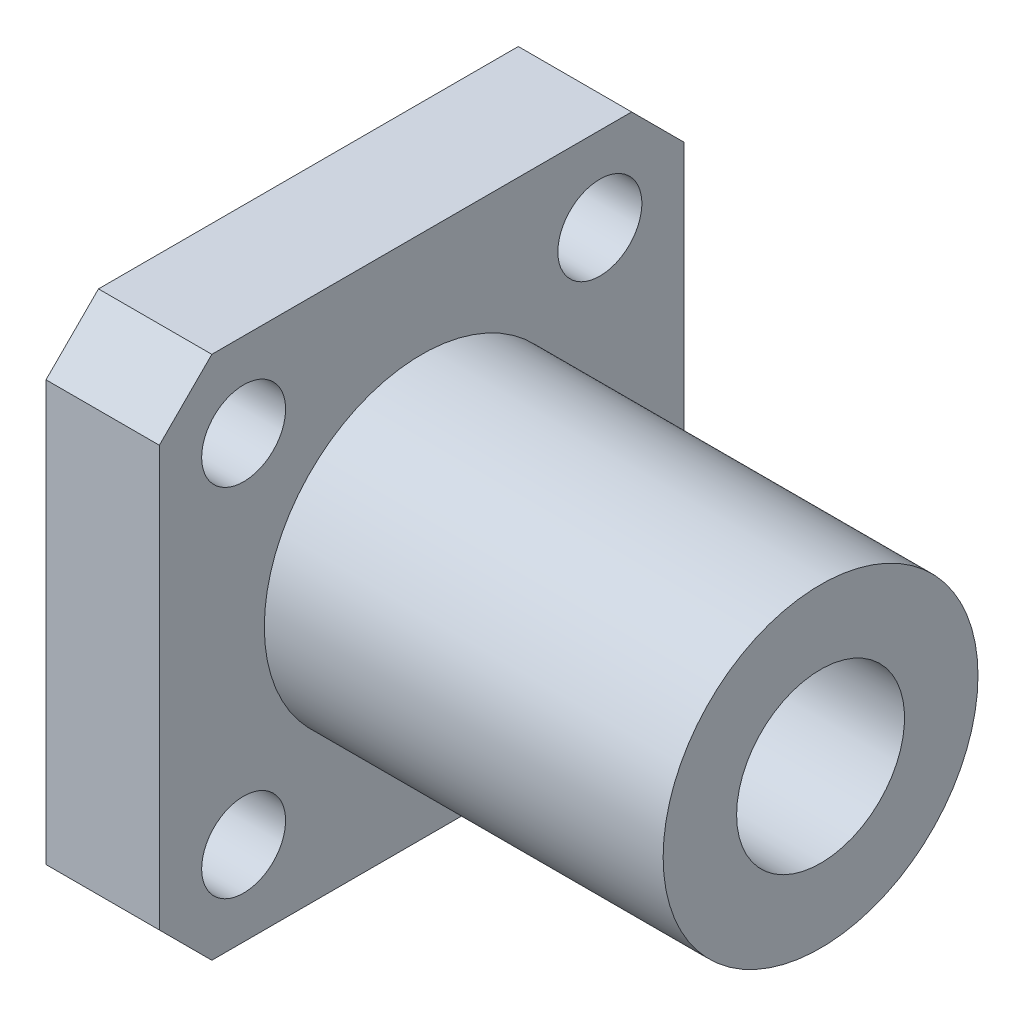
ISO-10303-21;
HEADER;
FILE_DESCRIPTION(('STEP AP214'),'2;1');
FILE_NAME('part.step','',(''),(''),'','','');
FILE_SCHEMA(('AUTOMOTIVE_DESIGN { 1 0 10303 214 1 1 1 1 }'));
ENDSEC;
DATA;
#1=APPLICATION_CONTEXT('core data for automotive mechanical design processes');
#2=APPLICATION_PROTOCOL_DEFINITION('international standard','automotive_design',2000,#1);
#3=PRODUCT_CONTEXT('',#1,'mechanical');
#4=PRODUCT('Part','Part','',(#3));
#5=PRODUCT_RELATED_PRODUCT_CATEGORY('part','',(#4));
#6=PRODUCT_DEFINITION_FORMATION('','',#4);
#7=PRODUCT_DEFINITION_CONTEXT('part definition',#1,'design');
#8=PRODUCT_DEFINITION('design','',#6,#7);
#9=PRODUCT_DEFINITION_SHAPE('','',#8);
#10=(LENGTH_UNIT() NAMED_UNIT(*) SI_UNIT(.MILLI.,.METRE.));
#11=(NAMED_UNIT(*) PLANE_ANGLE_UNIT() SI_UNIT($,.RADIAN.));
#12=(NAMED_UNIT(*) SI_UNIT($,.STERADIAN.) SOLID_ANGLE_UNIT());
#13=UNCERTAINTY_MEASURE_WITH_UNIT(LENGTH_MEASURE(1.E-05),#10,'distance_accuracy_value','');
#14=(GEOMETRIC_REPRESENTATION_CONTEXT(3) GLOBAL_UNCERTAINTY_ASSIGNED_CONTEXT((#13)) GLOBAL_UNIT_ASSIGNED_CONTEXT((#10,
#11,#12)) REPRESENTATION_CONTEXT('',''));
#15=CARTESIAN_POINT('',(0.,0.,0.));
#16=DIRECTION('',(0.,0.,1.));
#17=DIRECTION('',(1.,0.,0.));
#18=AXIS2_PLACEMENT_3D('',#15,#16,#17);
#19=CARTESIAN_POINT('',(5.4,0.,0.));
#20=DIRECTION('',(-1.,0.,0.));
#21=DIRECTION('',(0.,0.,1.));
#22=AXIS2_PLACEMENT_3D('',#19,#20,#21);
#23=PLANE('',#22);
#24=CARTESIAN_POINT('',(5.4,8.4852813742381,8.48528137423857));
#25=DIRECTION('',(1.,0.,0.));
#26=DIRECTION('',(0.,0.,-1.));
#27=AXIS2_PLACEMENT_3D('',#24,#25,#26);
#28=CIRCLE('',#27,2.00000000000051);
#29=CARTESIAN_POINT('',(5.4,8.4852813742381,10.4852813742391));
#30=VERTEX_POINT('',#29);
#31=EDGE_CURVE('E201',#30,#30,#28,.T.);
#32=ORIENTED_EDGE('',*,*,#31,.F.);
#33=EDGE_LOOP('',(#32));
#34=FACE_BOUND('',#33,.T.);
#35=CARTESIAN_POINT('',(5.4,-8.48528137423904,8.4852813742381));
#36=DIRECTION('',(1.,0.,0.));
#37=DIRECTION('',(0.,0.,-1.));
#38=AXIS2_PLACEMENT_3D('',#35,#36,#37);
#39=CIRCLE('',#38,2.00000000000035);
#40=CARTESIAN_POINT('',(5.4,-8.48528137423904,10.4852813742385));
#41=VERTEX_POINT('',#40);
#42=EDGE_CURVE('E195',#41,#41,#39,.T.);
#43=ORIENTED_EDGE('',*,*,#42,.F.);
#44=EDGE_LOOP('',(#43));
#45=FACE_BOUND('',#44,.T.);
#46=CARTESIAN_POINT('',(5.4,-8.48528137423857,-8.48528137423904));
#47=DIRECTION('',(1.,0.,0.));
#48=DIRECTION('',(0.,0.,-1.));
#49=AXIS2_PLACEMENT_3D('',#46,#47,#48);
#50=CIRCLE('',#49,1.99999999999988);
#51=CARTESIAN_POINT('',(5.4,-8.48528137423857,-6.48528137423916));
#52=VERTEX_POINT('',#51);
#53=EDGE_CURVE('E189',#52,#52,#50,.T.);
#54=ORIENTED_EDGE('',*,*,#53,.F.);
#55=EDGE_LOOP('',(#54));
#56=FACE_BOUND('',#55,.T.);
#57=CARTESIAN_POINT('',(5.4,8.48528137423857,-8.48528137423857));
#58=DIRECTION('',(1.,0.,0.));
#59=DIRECTION('',(0.,0.,-1.));
#60=AXIS2_PLACEMENT_3D('',#57,#58,#59);
#61=CIRCLE('',#60,2.);
#62=CARTESIAN_POINT('',(5.4,8.48528137423857,-6.48528137423857));
#63=VERTEX_POINT('',#62);
#64=EDGE_CURVE('E185',#63,#63,#61,.T.);
#65=ORIENTED_EDGE('',*,*,#64,.F.);
#66=EDGE_LOOP('',(#65));
#67=FACE_BOUND('',#66,.T.);
#68=DIRECTION('',(0.,0.,1.));
#69=VECTOR('',#68,1.);
#70=CARTESIAN_POINT('',(5.4,12.5,10.));
#71=LINE('',#70,#69);
#72=CARTESIAN_POINT('',(5.4,12.5,-9.99999999999999));
#73=VERTEX_POINT('',#72);
#74=CARTESIAN_POINT('',(5.4,12.5,10.));
#75=VERTEX_POINT('',#74);
#76=EDGE_CURVE('E145',#73,#75,#71,.T.);
#77=ORIENTED_EDGE('',*,*,#76,.T.);
#78=DIRECTION('',(0.,-0.707106781186548,0.707106781186548));
#79=VECTOR('',#78,1.);
#80=CARTESIAN_POINT('',(5.4,10.,12.5));
#81=LINE('',#80,#79);
#82=CARTESIAN_POINT('',(5.4,10.,12.5));
#83=VERTEX_POINT('',#82);
#84=EDGE_CURVE('E93',#75,#83,#81,.T.);
#85=ORIENTED_EDGE('',*,*,#84,.T.);
#86=DIRECTION('',(0.,-1.,0.));
#87=VECTOR('',#86,1.);
#88=CARTESIAN_POINT('',(5.4,10.,12.5));
#89=LINE('',#88,#87);
#90=CARTESIAN_POINT('',(5.4,-9.99999999999999,12.5));
#91=VERTEX_POINT('',#90);
#92=EDGE_CURVE('E177',#83,#91,#89,.T.);
#93=ORIENTED_EDGE('',*,*,#92,.T.);
#94=DIRECTION('',(0.,-0.707106781186548,-0.707106781186547));
#95=VECTOR('',#94,1.);
#96=CARTESIAN_POINT('',(5.4,-9.99999999999999,12.5));
#97=LINE('',#96,#95);
#98=CARTESIAN_POINT('',(5.4,-12.5,9.99999999999999));
#99=VERTEX_POINT('',#98);
#100=EDGE_CURVE('E176',#91,#99,#97,.T.);
#101=ORIENTED_EDGE('',*,*,#100,.T.);
#102=DIRECTION('',(0.,0.,-1.));
#103=VECTOR('',#102,1.);
#104=CARTESIAN_POINT('',(5.4,-12.5,9.99999999999999));
#105=LINE('',#104,#103);
#106=CARTESIAN_POINT('',(5.4,-12.5,-10.));
#107=VERTEX_POINT('',#106);
#108=EDGE_CURVE('E112',#99,#107,#105,.T.);
#109=ORIENTED_EDGE('',*,*,#108,.T.);
#110=DIRECTION('',(0.,0.707106781186548,-0.707106781186547));
#111=VECTOR('',#110,1.);
#112=CARTESIAN_POINT('',(5.4,-12.5,-10.));
#113=LINE('',#112,#111);
#114=CARTESIAN_POINT('',(5.4,-10.,-12.5));
#115=VERTEX_POINT('',#114);
#116=EDGE_CURVE('E106',#107,#115,#113,.T.);
#117=ORIENTED_EDGE('',*,*,#116,.T.);
#118=DIRECTION('',(0.,1.,0.));
#119=VECTOR('',#118,1.);
#120=CARTESIAN_POINT('',(5.4,10.,-12.5));
#121=LINE('',#120,#119);
#122=CARTESIAN_POINT('',(5.4,10.,-12.5));
#123=VERTEX_POINT('',#122);
#124=EDGE_CURVE('E110',#115,#123,#121,.T.);
#125=ORIENTED_EDGE('',*,*,#124,.T.);
#126=DIRECTION('',(0.,0.707106781186547,0.707106781186547));
#127=VECTOR('',#126,1.);
#128=CARTESIAN_POINT('',(5.4,12.5,-9.99999999999999));
#129=LINE('',#128,#127);
#130=EDGE_CURVE('E49',#123,#73,#129,.T.);
#131=ORIENTED_EDGE('',*,*,#130,.T.);
#132=EDGE_LOOP('',(#77,#85,#93,#101,#109,#117,#125,#131));
#133=FACE_BOUND('',#132,.T.);
#134=CARTESIAN_POINT('',(5.4,0.,0.));
#135=DIRECTION('',(-1.,0.,0.));
#136=DIRECTION('',(0.,0.,1.));
#137=AXIS2_PLACEMENT_3D('',#134,#135,#136);
#138=CIRCLE('',#137,7.5);
#139=CARTESIAN_POINT('',(5.4,0.,7.5));
#140=VERTEX_POINT('',#139);
#141=EDGE_CURVE('E11',#140,#140,#138,.F.);
#142=ORIENTED_EDGE('',*,*,#141,.F.);
#143=EDGE_LOOP('',(#142));
#144=FACE_BOUND('',#143,.T.);
#145=ADVANCED_FACE('F32',(#34,#45,#56,#67,#133,#144),#23,.F.);
#146=CARTESIAN_POINT('',(0.,0.,0.));
#147=DIRECTION('',(-1.,0.,0.));
#148=DIRECTION('',(0.,0.,1.));
#149=AXIS2_PLACEMENT_3D('',#146,#147,#148);
#150=PLANE('',#149);
#151=CARTESIAN_POINT('',(0.,-8.48528137423904,8.4852813742381));
#152=DIRECTION('',(1.,0.,0.));
#153=DIRECTION('',(0.,0.,-1.));
#154=AXIS2_PLACEMENT_3D('',#151,#152,#153);
#155=CIRCLE('',#154,2.00000000000035);
#156=CARTESIAN_POINT('',(0.,-8.48528137423904,10.4852813742385));
#157=VERTEX_POINT('',#156);
#158=EDGE_CURVE('E198',#157,#157,#155,.T.);
#159=ORIENTED_EDGE('',*,*,#158,.T.);
#160=EDGE_LOOP('',(#159));
#161=FACE_BOUND('',#160,.T.);
#162=CARTESIAN_POINT('',(0.,8.48528137423857,-8.48528137423857));
#163=DIRECTION('',(1.,0.,0.));
#164=DIRECTION('',(0.,0.,-1.));
#165=AXIS2_PLACEMENT_3D('',#162,#163,#164);
#166=CIRCLE('',#165,2.);
#167=CARTESIAN_POINT('',(0.,8.48528137423857,-6.48528137423857));
#168=VERTEX_POINT('',#167);
#169=EDGE_CURVE('E186',#168,#168,#166,.T.);
#170=ORIENTED_EDGE('',*,*,#169,.T.);
#171=EDGE_LOOP('',(#170));
#172=FACE_BOUND('',#171,.T.);
#173=DIRECTION('',(0.,0.,1.));
#174=VECTOR('',#173,1.);
#175=CARTESIAN_POINT('',(0.,12.5,10.));
#176=LINE('',#175,#174);
#177=CARTESIAN_POINT('',(0.,12.5,-9.99999999999999));
#178=VERTEX_POINT('',#177);
#179=CARTESIAN_POINT('',(0.,12.5,10.));
#180=VERTEX_POINT('',#179);
#181=EDGE_CURVE('E130',#178,#180,#176,.T.);
#182=ORIENTED_EDGE('',*,*,#181,.F.);
#183=DIRECTION('',(0.,0.707106781186547,0.707106781186547));
#184=VECTOR('',#183,1.);
#185=CARTESIAN_POINT('',(0.,12.5,-9.99999999999999));
#186=LINE('',#185,#184);
#187=CARTESIAN_POINT('',(0.,10.,-12.5));
#188=VERTEX_POINT('',#187);
#189=EDGE_CURVE('E84',#188,#178,#186,.T.);
#190=ORIENTED_EDGE('',*,*,#189,.F.);
#191=DIRECTION('',(0.,1.,0.));
#192=VECTOR('',#191,1.);
#193=CARTESIAN_POINT('',(0.,10.,-12.5));
#194=LINE('',#193,#192);
#195=CARTESIAN_POINT('',(0.,-10.,-12.5));
#196=VERTEX_POINT('',#195);
#197=EDGE_CURVE('E78',#196,#188,#194,.T.);
#198=ORIENTED_EDGE('',*,*,#197,.F.);
#199=DIRECTION('',(0.,0.707106781186548,-0.707106781186547));
#200=VECTOR('',#199,1.);
#201=CARTESIAN_POINT('',(0.,-12.5,-10.));
#202=LINE('',#201,#200);
#203=CARTESIAN_POINT('',(0.,-12.5,-10.));
#204=VERTEX_POINT('',#203);
#205=EDGE_CURVE('E120',#204,#196,#202,.T.);
#206=ORIENTED_EDGE('',*,*,#205,.F.);
#207=DIRECTION('',(0.,0.,-1.));
#208=VECTOR('',#207,1.);
#209=CARTESIAN_POINT('',(0.,-12.5,9.99999999999999));
#210=LINE('',#209,#208);
#211=CARTESIAN_POINT('',(0.,-12.5,9.99999999999999));
#212=VERTEX_POINT('',#211);
#213=EDGE_CURVE('E140',#212,#204,#210,.T.);
#214=ORIENTED_EDGE('',*,*,#213,.F.);
#215=DIRECTION('',(0.,-0.707106781186548,-0.707106781186547));
#216=VECTOR('',#215,1.);
#217=CARTESIAN_POINT('',(0.,-9.99999999999999,12.5));
#218=LINE('',#217,#216);
#219=CARTESIAN_POINT('',(0.,-9.99999999999999,12.5));
#220=VERTEX_POINT('',#219);
#221=EDGE_CURVE('E138',#220,#212,#218,.T.);
#222=ORIENTED_EDGE('',*,*,#221,.F.);
#223=DIRECTION('',(0.,-1.,0.));
#224=VECTOR('',#223,1.);
#225=CARTESIAN_POINT('',(0.,10.,12.5));
#226=LINE('',#225,#224);
#227=CARTESIAN_POINT('',(0.,10.,12.5));
#228=VERTEX_POINT('',#227);
#229=EDGE_CURVE('E136',#228,#220,#226,.T.);
#230=ORIENTED_EDGE('',*,*,#229,.F.);
#231=DIRECTION('',(0.,-0.707106781186548,0.707106781186548));
#232=VECTOR('',#231,1.);
#233=CARTESIAN_POINT('',(0.,10.,12.5));
#234=LINE('',#233,#232);
#235=EDGE_CURVE('E133',#180,#228,#234,.T.);
#236=ORIENTED_EDGE('',*,*,#235,.F.);
#237=EDGE_LOOP('',(#182,#190,#198,#206,#214,#222,#230,#236));
#238=FACE_BOUND('',#237,.T.);
#239=CARTESIAN_POINT('',(0.,0.,0.));
#240=DIRECTION('',(1.,0.,0.));
#241=DIRECTION('',(0.,0.,-1.));
#242=AXIS2_PLACEMENT_3D('',#239,#240,#241);
#243=CIRCLE('',#242,4.);
#244=CARTESIAN_POINT('',(0.,0.,4.));
#245=VERTEX_POINT('',#244);
#246=EDGE_CURVE('E134',#245,#245,#243,.T.);
#247=ORIENTED_EDGE('',*,*,#246,.T.);
#248=EDGE_LOOP('',(#247));
#249=FACE_BOUND('',#248,.T.);
#250=CARTESIAN_POINT('',(0.,-8.48528137423857,-8.48528137423904));
#251=DIRECTION('',(1.,0.,0.));
#252=DIRECTION('',(0.,0.,-1.));
#253=AXIS2_PLACEMENT_3D('',#250,#251,#252);
#254=CIRCLE('',#253,1.99999999999988);
#255=CARTESIAN_POINT('',(0.,-8.48528137423857,-6.48528137423916));
#256=VERTEX_POINT('',#255);
#257=EDGE_CURVE('E192',#256,#256,#254,.T.);
#258=ORIENTED_EDGE('',*,*,#257,.T.);
#259=EDGE_LOOP('',(#258));
#260=FACE_BOUND('',#259,.T.);
#261=CARTESIAN_POINT('',(0.,8.4852813742381,8.48528137423857));
#262=DIRECTION('',(1.,0.,0.));
#263=DIRECTION('',(0.,0.,-1.));
#264=AXIS2_PLACEMENT_3D('',#261,#262,#263);
#265=CIRCLE('',#264,2.00000000000051);
#266=CARTESIAN_POINT('',(0.,8.4852813742381,10.4852813742391));
#267=VERTEX_POINT('',#266);
#268=EDGE_CURVE('E204',#267,#267,#265,.T.);
#269=ORIENTED_EDGE('',*,*,#268,.T.);
#270=EDGE_LOOP('',(#269));
#271=FACE_BOUND('',#270,.T.);
#272=ADVANCED_FACE('F163',(#161,#172,#238,#249,#260,#271),#150,.T.);
#273=CARTESIAN_POINT('',(5.4,12.5,10.));
#274=DIRECTION('',(0.,-1.,0.));
#275=DIRECTION('',(0.,0.,-1.));
#276=AXIS2_PLACEMENT_3D('',#273,#274,#275);
#277=PLANE('',#276);
#278=ORIENTED_EDGE('',*,*,#181,.T.);
#279=DIRECTION('',(-1.,0.,0.));
#280=VECTOR('',#279,1.);
#281=CARTESIAN_POINT('',(5.4,12.5,10.));
#282=LINE('',#281,#280);
#283=EDGE_CURVE('E41',#75,#180,#282,.T.);
#284=ORIENTED_EDGE('',*,*,#283,.F.);
#285=ORIENTED_EDGE('',*,*,#76,.F.);
#286=DIRECTION('',(-1.,0.,0.));
#287=VECTOR('',#286,1.);
#288=CARTESIAN_POINT('',(5.4,12.5,-9.99999999999999));
#289=LINE('',#288,#287);
#290=EDGE_CURVE('E126',#73,#178,#289,.T.);
#291=ORIENTED_EDGE('',*,*,#290,.T.);
#292=EDGE_LOOP('',(#278,#284,#285,#291));
#293=FACE_BOUND('',#292,.T.);
#294=ADVANCED_FACE('F34',(#293),#277,.F.);
#295=CARTESIAN_POINT('',(5.4,10.,12.5));
#296=DIRECTION('',(0.,-0.707106781186547,-0.707106781186547));
#297=DIRECTION('',(0.,0.707106781186548,-0.707106781186548));
#298=AXIS2_PLACEMENT_3D('',#295,#296,#297);
#299=PLANE('',#298);
#300=ORIENTED_EDGE('',*,*,#235,.T.);
#301=DIRECTION('',(-1.,0.,0.));
#302=VECTOR('',#301,1.);
#303=CARTESIAN_POINT('',(5.4,10.,12.5));
#304=LINE('',#303,#302);
#305=EDGE_CURVE('E155',#83,#228,#304,.T.);
#306=ORIENTED_EDGE('',*,*,#305,.F.);
#307=ORIENTED_EDGE('',*,*,#84,.F.);
#308=ORIENTED_EDGE('',*,*,#283,.T.);
#309=EDGE_LOOP('',(#300,#306,#307,#308));
#310=FACE_BOUND('',#309,.T.);
#311=ADVANCED_FACE('F158',(#310),#299,.F.);
#312=CARTESIAN_POINT('',(5.4,10.,12.5));
#313=DIRECTION('',(0.,0.,-1.));
#314=DIRECTION('',(0.,1.,0.));
#315=AXIS2_PLACEMENT_3D('',#312,#313,#314);
#316=PLANE('',#315);
#317=ORIENTED_EDGE('',*,*,#229,.T.);
#318=DIRECTION('',(-1.,0.,0.));
#319=VECTOR('',#318,1.);
#320=CARTESIAN_POINT('',(5.4,-9.99999999999999,12.5));
#321=LINE('',#320,#319);
#322=EDGE_CURVE('E152',#91,#220,#321,.T.);
#323=ORIENTED_EDGE('',*,*,#322,.F.);
#324=ORIENTED_EDGE('',*,*,#92,.F.);
#325=ORIENTED_EDGE('',*,*,#305,.T.);
#326=EDGE_LOOP('',(#317,#323,#324,#325));
#327=FACE_BOUND('',#326,.T.);
#328=ADVANCED_FACE('F170',(#327),#316,.F.);
#329=CARTESIAN_POINT('',(5.4,-9.99999999999999,12.5));
#330=DIRECTION('',(0.,0.707106781186547,-0.707106781186548));
#331=DIRECTION('',(0.,0.707106781186548,0.707106781186547));
#332=AXIS2_PLACEMENT_3D('',#329,#330,#331);
#333=PLANE('',#332);
#334=ORIENTED_EDGE('',*,*,#221,.T.);
#335=DIRECTION('',(-1.,0.,0.));
#336=VECTOR('',#335,1.);
#337=CARTESIAN_POINT('',(5.4,-12.5,9.99999999999999));
#338=LINE('',#337,#336);
#339=EDGE_CURVE('E149',#99,#212,#338,.T.);
#340=ORIENTED_EDGE('',*,*,#339,.F.);
#341=ORIENTED_EDGE('',*,*,#100,.F.);
#342=ORIENTED_EDGE('',*,*,#322,.T.);
#343=EDGE_LOOP('',(#334,#340,#341,#342));
#344=FACE_BOUND('',#343,.T.);
#345=ADVANCED_FACE('F174',(#344),#333,.F.);
#346=CARTESIAN_POINT('',(5.4,-12.5,9.99999999999999));
#347=DIRECTION('',(0.,1.,0.));
#348=DIRECTION('',(0.,0.,1.));
#349=AXIS2_PLACEMENT_3D('',#346,#347,#348);
#350=PLANE('',#349);
#351=ORIENTED_EDGE('',*,*,#213,.T.);
#352=DIRECTION('',(-1.,0.,0.));
#353=VECTOR('',#352,1.);
#354=CARTESIAN_POINT('',(5.4,-12.5,-10.));
#355=LINE('',#354,#353);
#356=EDGE_CURVE('E121',#107,#204,#355,.T.);
#357=ORIENTED_EDGE('',*,*,#356,.F.);
#358=ORIENTED_EDGE('',*,*,#108,.F.);
#359=ORIENTED_EDGE('',*,*,#339,.T.);
#360=EDGE_LOOP('',(#351,#357,#358,#359));
#361=FACE_BOUND('',#360,.T.);
#362=ADVANCED_FACE('F253',(#361),#350,.F.);
#363=CARTESIAN_POINT('',(5.4,-12.5,-10.));
#364=DIRECTION('',(0.,0.707106781186547,0.707106781186548));
#365=DIRECTION('',(0.,-0.707106781186548,0.707106781186547));
#366=AXIS2_PLACEMENT_3D('',#363,#364,#365);
#367=PLANE('',#366);
#368=ORIENTED_EDGE('',*,*,#205,.T.);
#369=DIRECTION('',(-1.,0.,0.));
#370=VECTOR('',#369,1.);
#371=CARTESIAN_POINT('',(5.4,-10.,-12.5));
#372=LINE('',#371,#370);
#373=EDGE_CURVE('E117',#115,#196,#372,.T.);
#374=ORIENTED_EDGE('',*,*,#373,.F.);
#375=ORIENTED_EDGE('',*,*,#116,.F.);
#376=ORIENTED_EDGE('',*,*,#356,.T.);
#377=EDGE_LOOP('',(#368,#374,#375,#376));
#378=FACE_BOUND('',#377,.T.);
#379=ADVANCED_FACE('F118',(#378),#367,.F.);
#380=CARTESIAN_POINT('',(5.4,10.,-12.5));
#381=DIRECTION('',(0.,0.,1.));
#382=DIRECTION('',(0.,-1.,0.));
#383=AXIS2_PLACEMENT_3D('',#380,#381,#382);
#384=PLANE('',#383);
#385=ORIENTED_EDGE('',*,*,#197,.T.);
#386=DIRECTION('',(-1.,0.,0.));
#387=VECTOR('',#386,1.);
#388=CARTESIAN_POINT('',(5.4,10.,-12.5));
#389=LINE('',#388,#387);
#390=EDGE_CURVE('E122',#123,#188,#389,.T.);
#391=ORIENTED_EDGE('',*,*,#390,.F.);
#392=ORIENTED_EDGE('',*,*,#124,.F.);
#393=ORIENTED_EDGE('',*,*,#373,.T.);
#394=EDGE_LOOP('',(#385,#391,#392,#393));
#395=FACE_BOUND('',#394,.T.);
#396=ADVANCED_FACE('F124',(#395),#384,.F.);
#397=CARTESIAN_POINT('',(5.4,12.5,-9.99999999999999));
#398=DIRECTION('',(0.,-0.707106781186547,0.707106781186547));
#399=DIRECTION('',(0.,-0.707106781186548,-0.707106781186548));
#400=AXIS2_PLACEMENT_3D('',#397,#398,#399);
#401=PLANE('',#400);
#402=ORIENTED_EDGE('',*,*,#189,.T.);
#403=ORIENTED_EDGE('',*,*,#290,.F.);
#404=ORIENTED_EDGE('',*,*,#130,.F.);
#405=ORIENTED_EDGE('',*,*,#390,.T.);
#406=EDGE_LOOP('',(#402,#403,#404,#405));
#407=FACE_BOUND('',#406,.T.);
#408=ADVANCED_FACE('F246',(#407),#401,.F.);
#409=CARTESIAN_POINT('',(5.4,0.,0.));
#410=DIRECTION('',(-1.,0.,0.));
#411=DIRECTION('',(0.,0.,1.));
#412=AXIS2_PLACEMENT_3D('',#409,#410,#411);
#413=CYLINDRICAL_SURFACE('',#412,4.);
#414=CARTESIAN_POINT('',(24.4,0.,0.));
#415=DIRECTION('',(1.,0.,0.));
#416=DIRECTION('',(0.,0.,-1.));
#417=AXIS2_PLACEMENT_3D('',#414,#415,#416);
#418=CIRCLE('',#417,4.);
#419=CARTESIAN_POINT('',(24.4,0.,4.));
#420=VERTEX_POINT('',#419);
#421=EDGE_CURVE('E212',#420,#420,#418,.T.);
#422=CARTESIAN_POINT('',(0.,0.,4.));
#423=CARTESIAN_POINT('',(0.254166666666666,0.,4.));
#424=CARTESIAN_POINT('',(0.508333333333333,0.,4.));
#425=CARTESIAN_POINT('',(1.01666666666667,0.,4.));
#426=CARTESIAN_POINT('',(1.27083333333333,0.,4.));
#427=CARTESIAN_POINT('',(1.77916666666667,0.,4.));
#428=CARTESIAN_POINT('',(2.03333333333333,0.,4.));
#429=CARTESIAN_POINT('',(2.54166666666667,0.,4.));
#430=CARTESIAN_POINT('',(2.79583333333333,0.,4.));
#431=CARTESIAN_POINT('',(3.30416666666666,0.,4.));
#432=CARTESIAN_POINT('',(3.55833333333333,0.,4.));
#433=CARTESIAN_POINT('',(4.06666666666666,0.,4.));
#434=CARTESIAN_POINT('',(4.32083333333333,0.,4.));
#435=CARTESIAN_POINT('',(4.82916666666666,0.,4.));
#436=CARTESIAN_POINT('',(5.08333333333333,0.,4.));
#437=CARTESIAN_POINT('',(5.59166666666666,0.,4.));
#438=CARTESIAN_POINT('',(5.84583333333333,0.,4.));
#439=CARTESIAN_POINT('',(6.35416666666666,0.,4.));
#440=CARTESIAN_POINT('',(6.60833333333333,0.,4.));
#441=CARTESIAN_POINT('',(7.11666666666666,0.,4.));
#442=CARTESIAN_POINT('',(7.37083333333333,0.,4.));
#443=CARTESIAN_POINT('',(7.87916666666666,0.,4.));
#444=CARTESIAN_POINT('',(8.13333333333333,0.,4.));
#445=CARTESIAN_POINT('',(8.64166666666666,0.,4.));
#446=CARTESIAN_POINT('',(8.89583333333333,0.,4.));
#447=CARTESIAN_POINT('',(9.40416666666666,0.,4.));
#448=CARTESIAN_POINT('',(9.65833333333333,0.,4.));
#449=CARTESIAN_POINT('',(10.1666666666667,0.,4.));
#450=CARTESIAN_POINT('',(10.4208333333333,0.,4.));
#451=CARTESIAN_POINT('',(10.9291666666667,0.,4.));
#452=CARTESIAN_POINT('',(11.1833333333333,0.,4.));
#453=CARTESIAN_POINT('',(11.6916666666667,0.,4.));
#454=CARTESIAN_POINT('',(11.9458333333333,0.,4.));
#455=CARTESIAN_POINT('',(12.4541666666667,0.,4.));
#456=CARTESIAN_POINT('',(12.7083333333333,0.,4.));
#457=CARTESIAN_POINT('',(13.2166666666667,0.,4.));
#458=CARTESIAN_POINT('',(13.4708333333333,0.,4.));
#459=CARTESIAN_POINT('',(13.9791666666667,0.,4.));
#460=CARTESIAN_POINT('',(14.2333333333333,0.,4.));
#461=CARTESIAN_POINT('',(14.7416666666667,0.,4.));
#462=CARTESIAN_POINT('',(14.9958333333333,0.,4.));
#463=CARTESIAN_POINT('',(15.5041666666667,0.,4.));
#464=CARTESIAN_POINT('',(15.7583333333333,0.,4.));
#465=CARTESIAN_POINT('',(16.2666666666667,0.,4.));
#466=CARTESIAN_POINT('',(16.5208333333333,0.,4.));
#467=CARTESIAN_POINT('',(17.0291666666667,0.,4.));
#468=CARTESIAN_POINT('',(17.2833333333333,0.,4.));
#469=CARTESIAN_POINT('',(17.7916666666667,0.,4.));
#470=CARTESIAN_POINT('',(18.0458333333333,0.,4.));
#471=CARTESIAN_POINT('',(18.5541666666667,0.,4.));
#472=CARTESIAN_POINT('',(18.8083333333333,0.,4.));
#473=CARTESIAN_POINT('',(19.3166666666667,0.,4.));
#474=CARTESIAN_POINT('',(19.5708333333333,0.,4.));
#475=CARTESIAN_POINT('',(20.0791666666667,0.,4.));
#476=CARTESIAN_POINT('',(20.3333333333333,0.,4.));
#477=CARTESIAN_POINT('',(20.8416666666667,0.,4.));
#478=CARTESIAN_POINT('',(21.0958333333333,0.,4.));
#479=CARTESIAN_POINT('',(21.6041666666667,0.,4.));
#480=CARTESIAN_POINT('',(21.8583333333333,0.,4.));
#481=CARTESIAN_POINT('',(22.3666666666667,0.,4.));
#482=CARTESIAN_POINT('',(22.6208333333333,0.,4.));
#483=CARTESIAN_POINT('',(23.1291666666667,0.,4.));
#484=CARTESIAN_POINT('',(23.3833333333333,0.,4.));
#485=CARTESIAN_POINT('',(23.8916666666667,0.,4.));
#486=CARTESIAN_POINT('',(24.1458333333333,0.,4.));
#487=CARTESIAN_POINT('',(24.4,0.,4.));
#488=B_SPLINE_CURVE_WITH_KNOTS('',3,(#422,#423,#424,#425,#426,#427,#428,#429,#430,#431,#432,
#433,#434,#435,#436,#437,#438,#439,#440,#441,#442,#443,#444,#445,#446,#447,#448,#449,#450,#451,
#452,#453,#454,#455,#456,#457,#458,#459,#460,#461,#462,#463,#464,#465,#466,#467,#468,#469,#470,
#471,#472,#473,#474,#475,#476,#477,#478,#479,#480,#481,#482,#483,#484,#485,#486,#487),
.UNSPECIFIED.,.F.,.F.,(4,2,2,2,2,2,2,2,2,2,2,2,2,2,2,2,2,2,2,2,2,2,2,2,2,2,2,2,2,2,2,2,4),(0.,
0.7625,1.525,2.2875,3.05,3.8125,4.575,5.3375,6.1,6.8625,7.625,8.3875,9.15,9.9125,10.675,11.4375,
12.2,12.9625,13.725,14.4875,15.25,16.0125,16.775,17.5375,18.3,19.0625,19.825,20.5875,21.35,
22.1125,22.875,23.6375,24.4),.UNSPECIFIED.);
#489=EDGE_CURVE('BSEAM216',#245,#420,#488,.T.);
#490=ORIENTED_EDGE('',*,*,#246,.F.);
#491=ORIENTED_EDGE('',*,*,#421,.T.);
#492=ORIENTED_EDGE('',*,*,#489,.T.);
#493=ORIENTED_EDGE('',*,*,#489,.F.);
#494=EDGE_LOOP('',(#490,#492,#491,#493));
#495=FACE_BOUND('',#494,.T.);
#496=ADVANCED_FACE('F216',(#495),#413,.F.);
#497=CARTESIAN_POINT('',(5.4,8.48528137423857,-8.48528137423857));
#498=DIRECTION('',(-1.,0.,0.));
#499=DIRECTION('',(0.,0.,1.));
#500=AXIS2_PLACEMENT_3D('',#497,#498,#499);
#501=CYLINDRICAL_SURFACE('',#500,2.);
#502=CARTESIAN_POINT('',(5.4,8.48528137423857,-6.48528137423857));
#503=CARTESIAN_POINT('',(5.34375,8.48528137423857,-6.48528137423857));
#504=CARTESIAN_POINT('',(5.2875,8.48528137423857,-6.48528137423857));
#505=CARTESIAN_POINT('',(5.175,8.48528137423857,-6.48528137423857));
#506=CARTESIAN_POINT('',(5.11875,8.48528137423857,-6.48528137423857));
#507=CARTESIAN_POINT('',(5.00625,8.48528137423857,-6.48528137423857));
#508=CARTESIAN_POINT('',(4.95,8.48528137423857,-6.48528137423857));
#509=CARTESIAN_POINT('',(4.8375,8.48528137423857,-6.48528137423857));
#510=CARTESIAN_POINT('',(4.78125,8.48528137423857,-6.48528137423857));
#511=CARTESIAN_POINT('',(4.66875,8.48528137423857,-6.48528137423857));
#512=CARTESIAN_POINT('',(4.6125,8.48528137423857,-6.48528137423857));
#513=CARTESIAN_POINT('',(4.5,8.48528137423857,-6.48528137423857));
#514=CARTESIAN_POINT('',(4.44375,8.48528137423857,-6.48528137423857));
#515=CARTESIAN_POINT('',(4.33125,8.48528137423857,-6.48528137423857));
#516=CARTESIAN_POINT('',(4.275,8.48528137423857,-6.48528137423857));
#517=CARTESIAN_POINT('',(4.1625,8.48528137423857,-6.48528137423857));
#518=CARTESIAN_POINT('',(4.10625,8.48528137423857,-6.48528137423857));
#519=CARTESIAN_POINT('',(3.99375,8.48528137423857,-6.48528137423857));
#520=CARTESIAN_POINT('',(3.9375,8.48528137423857,-6.48528137423857));
#521=CARTESIAN_POINT('',(3.825,8.48528137423857,-6.48528137423857));
#522=CARTESIAN_POINT('',(3.76875,8.48528137423857,-6.48528137423857));
#523=CARTESIAN_POINT('',(3.65625,8.48528137423857,-6.48528137423857));
#524=CARTESIAN_POINT('',(3.6,8.48528137423857,-6.48528137423857));
#525=CARTESIAN_POINT('',(3.4875,8.48528137423857,-6.48528137423857));
#526=CARTESIAN_POINT('',(3.43125,8.48528137423857,-6.48528137423857));
#527=CARTESIAN_POINT('',(3.31875,8.48528137423857,-6.48528137423857));
#528=CARTESIAN_POINT('',(3.2625,8.48528137423857,-6.48528137423857));
#529=CARTESIAN_POINT('',(3.15,8.48528137423857,-6.48528137423857));
#530=CARTESIAN_POINT('',(3.09375,8.48528137423857,-6.48528137423857));
#531=CARTESIAN_POINT('',(2.98125,8.48528137423857,-6.48528137423857));
#532=CARTESIAN_POINT('',(2.925,8.48528137423857,-6.48528137423857));
#533=CARTESIAN_POINT('',(2.8125,8.48528137423857,-6.48528137423857));
#534=CARTESIAN_POINT('',(2.75625,8.48528137423857,-6.48528137423857));
#535=CARTESIAN_POINT('',(2.64375,8.48528137423857,-6.48528137423857));
#536=CARTESIAN_POINT('',(2.5875,8.48528137423857,-6.48528137423857));
#537=CARTESIAN_POINT('',(2.475,8.48528137423857,-6.48528137423857));
#538=CARTESIAN_POINT('',(2.41875,8.48528137423857,-6.48528137423857));
#539=CARTESIAN_POINT('',(2.30625,8.48528137423857,-6.48528137423857));
#540=CARTESIAN_POINT('',(2.25,8.48528137423857,-6.48528137423857));
#541=CARTESIAN_POINT('',(2.1375,8.48528137423857,-6.48528137423857));
#542=CARTESIAN_POINT('',(2.08125,8.48528137423857,-6.48528137423857));
#543=CARTESIAN_POINT('',(1.96875,8.48528137423857,-6.48528137423857));
#544=CARTESIAN_POINT('',(1.9125,8.48528137423857,-6.48528137423857));
#545=CARTESIAN_POINT('',(1.8,8.48528137423857,-6.48528137423857));
#546=CARTESIAN_POINT('',(1.74375,8.48528137423857,-6.48528137423857));
#547=CARTESIAN_POINT('',(1.63125,8.48528137423857,-6.48528137423857));
#548=CARTESIAN_POINT('',(1.575,8.48528137423857,-6.48528137423857));
#549=CARTESIAN_POINT('',(1.4625,8.48528137423857,-6.48528137423857));
#550=CARTESIAN_POINT('',(1.40625,8.48528137423857,-6.48528137423857));
#551=CARTESIAN_POINT('',(1.29375,8.48528137423857,-6.48528137423857));
#552=CARTESIAN_POINT('',(1.2375,8.48528137423857,-6.48528137423857));
#553=CARTESIAN_POINT('',(1.125,8.48528137423857,-6.48528137423857));
#554=CARTESIAN_POINT('',(1.06875,8.48528137423857,-6.48528137423857));
#555=CARTESIAN_POINT('',(0.956249999999999,8.48528137423857,-6.48528137423857));
#556=CARTESIAN_POINT('',(0.899999999999999,8.48528137423857,-6.48528137423857));
#557=CARTESIAN_POINT('',(0.787499999999999,8.48528137423857,-6.48528137423857));
#558=CARTESIAN_POINT('',(0.731249999999999,8.48528137423857,-6.48528137423857));
#559=CARTESIAN_POINT('',(0.618749999999999,8.48528137423857,-6.48528137423857));
#560=CARTESIAN_POINT('',(0.562499999999999,8.48528137423857,-6.48528137423857));
#561=CARTESIAN_POINT('',(0.449999999999999,8.48528137423857,-6.48528137423857));
#562=CARTESIAN_POINT('',(0.393749999999999,8.48528137423857,-6.48528137423857));
#563=CARTESIAN_POINT('',(0.281249999999999,8.48528137423857,-6.48528137423857));
#564=CARTESIAN_POINT('',(0.224999999999999,8.48528137423857,-6.48528137423857));
#565=CARTESIAN_POINT('',(0.112499999999999,8.48528137423857,-6.48528137423857));
#566=CARTESIAN_POINT('',(0.0562499999999989,8.48528137423857,-6.48528137423857));
#567=CARTESIAN_POINT('',(0.,8.48528137423857,-6.48528137423857));
#568=B_SPLINE_CURVE_WITH_KNOTS('',3,(#502,#503,#504,#505,#506,#507,#508,#509,#510,#511,#512,
#513,#514,#515,#516,#517,#518,#519,#520,#521,#522,#523,#524,#525,#526,#527,#528,#529,#530,#531,
#532,#533,#534,#535,#536,#537,#538,#539,#540,#541,#542,#543,#544,#545,#546,#547,#548,#549,#550,
#551,#552,#553,#554,#555,#556,#557,#558,#559,#560,#561,#562,#563,#564,#565,#566,#567),
.UNSPECIFIED.,.F.,.F.,(4,2,2,2,2,2,2,2,2,2,2,2,2,2,2,2,2,2,2,2,2,2,2,2,2,2,2,2,2,2,2,2,4),(0.,
0.16875,0.337499999999999,0.50625,0.674999999999999,0.84375,1.0125,1.18125,1.35,1.51875,1.6875,
1.85625,2.025,2.19375,2.3625,2.53125,2.7,2.86875,3.0375,3.20625,3.375,3.54375,3.7125,3.88125,
4.05,4.21875,4.3875,4.55625,4.725,4.89375,5.0625,5.23125,5.4),.UNSPECIFIED.);
#569=EDGE_CURVE('BSEAM317',#63,#168,#568,.T.);
#570=ORIENTED_EDGE('',*,*,#64,.T.);
#571=ORIENTED_EDGE('',*,*,#169,.F.);
#572=ORIENTED_EDGE('',*,*,#569,.T.);
#573=ORIENTED_EDGE('',*,*,#569,.F.);
#574=EDGE_LOOP('',(#570,#572,#571,#573));
#575=FACE_BOUND('',#574,.T.);
#576=ADVANCED_FACE('F317',(#575),#501,.F.);
#577=CARTESIAN_POINT('',(5.4,-8.48528137423857,-8.48528137423904));
#578=DIRECTION('',(-1.,0.,0.));
#579=DIRECTION('',(0.,0.,1.));
#580=AXIS2_PLACEMENT_3D('',#577,#578,#579);
#581=CYLINDRICAL_SURFACE('',#580,1.99999999999988);
#582=CARTESIAN_POINT('',(5.4,-8.48528137423857,-6.48528137423916));
#583=CARTESIAN_POINT('',(5.34375,-8.48528137423857,-6.48528137423916));
#584=CARTESIAN_POINT('',(5.2875,-8.48528137423857,-6.48528137423916));
#585=CARTESIAN_POINT('',(5.175,-8.48528137423857,-6.48528137423916));
#586=CARTESIAN_POINT('',(5.11875,-8.48528137423857,-6.48528137423916));
#587=CARTESIAN_POINT('',(5.00625,-8.48528137423857,-6.48528137423916));
#588=CARTESIAN_POINT('',(4.95,-8.48528137423857,-6.48528137423916));
#589=CARTESIAN_POINT('',(4.8375,-8.48528137423857,-6.48528137423916));
#590=CARTESIAN_POINT('',(4.78125,-8.48528137423857,-6.48528137423916));
#591=CARTESIAN_POINT('',(4.66875,-8.48528137423857,-6.48528137423916));
#592=CARTESIAN_POINT('',(4.6125,-8.48528137423857,-6.48528137423916));
#593=CARTESIAN_POINT('',(4.5,-8.48528137423857,-6.48528137423916));
#594=CARTESIAN_POINT('',(4.44375,-8.48528137423857,-6.48528137423916));
#595=CARTESIAN_POINT('',(4.33125,-8.48528137423857,-6.48528137423916));
#596=CARTESIAN_POINT('',(4.275,-8.48528137423857,-6.48528137423916));
#597=CARTESIAN_POINT('',(4.1625,-8.48528137423857,-6.48528137423916));
#598=CARTESIAN_POINT('',(4.10625,-8.48528137423857,-6.48528137423916));
#599=CARTESIAN_POINT('',(3.99375,-8.48528137423857,-6.48528137423916));
#600=CARTESIAN_POINT('',(3.9375,-8.48528137423857,-6.48528137423916));
#601=CARTESIAN_POINT('',(3.825,-8.48528137423857,-6.48528137423916));
#602=CARTESIAN_POINT('',(3.76875,-8.48528137423857,-6.48528137423916));
#603=CARTESIAN_POINT('',(3.65625,-8.48528137423857,-6.48528137423916));
#604=CARTESIAN_POINT('',(3.6,-8.48528137423857,-6.48528137423916));
#605=CARTESIAN_POINT('',(3.4875,-8.48528137423857,-6.48528137423916));
#606=CARTESIAN_POINT('',(3.43125,-8.48528137423857,-6.48528137423916));
#607=CARTESIAN_POINT('',(3.31875,-8.48528137423857,-6.48528137423916));
#608=CARTESIAN_POINT('',(3.2625,-8.48528137423857,-6.48528137423916));
#609=CARTESIAN_POINT('',(3.15,-8.48528137423857,-6.48528137423916));
#610=CARTESIAN_POINT('',(3.09375,-8.48528137423857,-6.48528137423916));
#611=CARTESIAN_POINT('',(2.98125,-8.48528137423857,-6.48528137423916));
#612=CARTESIAN_POINT('',(2.925,-8.48528137423857,-6.48528137423916));
#613=CARTESIAN_POINT('',(2.8125,-8.48528137423857,-6.48528137423916));
#614=CARTESIAN_POINT('',(2.75625,-8.48528137423857,-6.48528137423916));
#615=CARTESIAN_POINT('',(2.64375,-8.48528137423857,-6.48528137423916));
#616=CARTESIAN_POINT('',(2.5875,-8.48528137423857,-6.48528137423916));
#617=CARTESIAN_POINT('',(2.475,-8.48528137423857,-6.48528137423916));
#618=CARTESIAN_POINT('',(2.41875,-8.48528137423857,-6.48528137423916));
#619=CARTESIAN_POINT('',(2.30625,-8.48528137423857,-6.48528137423916));
#620=CARTESIAN_POINT('',(2.25,-8.48528137423857,-6.48528137423916));
#621=CARTESIAN_POINT('',(2.1375,-8.48528137423857,-6.48528137423916));
#622=CARTESIAN_POINT('',(2.08125,-8.48528137423857,-6.48528137423916));
#623=CARTESIAN_POINT('',(1.96875,-8.48528137423857,-6.48528137423916));
#624=CARTESIAN_POINT('',(1.9125,-8.48528137423857,-6.48528137423916));
#625=CARTESIAN_POINT('',(1.8,-8.48528137423857,-6.48528137423916));
#626=CARTESIAN_POINT('',(1.74375,-8.48528137423857,-6.48528137423916));
#627=CARTESIAN_POINT('',(1.63125,-8.48528137423857,-6.48528137423916));
#628=CARTESIAN_POINT('',(1.575,-8.48528137423857,-6.48528137423916));
#629=CARTESIAN_POINT('',(1.4625,-8.48528137423857,-6.48528137423916));
#630=CARTESIAN_POINT('',(1.40625,-8.48528137423857,-6.48528137423916));
#631=CARTESIAN_POINT('',(1.29375,-8.48528137423857,-6.48528137423916));
#632=CARTESIAN_POINT('',(1.2375,-8.48528137423857,-6.48528137423916));
#633=CARTESIAN_POINT('',(1.125,-8.48528137423857,-6.48528137423916));
#634=CARTESIAN_POINT('',(1.06875,-8.48528137423857,-6.48528137423916));
#635=CARTESIAN_POINT('',(0.956249999999999,-8.48528137423857,-6.48528137423916));
#636=CARTESIAN_POINT('',(0.899999999999999,-8.48528137423857,-6.48528137423916));
#637=CARTESIAN_POINT('',(0.787499999999999,-8.48528137423857,-6.48528137423916));
#638=CARTESIAN_POINT('',(0.731249999999999,-8.48528137423857,-6.48528137423916));
#639=CARTESIAN_POINT('',(0.618749999999999,-8.48528137423857,-6.48528137423916));
#640=CARTESIAN_POINT('',(0.562499999999999,-8.48528137423857,-6.48528137423916));
#641=CARTESIAN_POINT('',(0.449999999999999,-8.48528137423857,-6.48528137423916));
#642=CARTESIAN_POINT('',(0.393749999999999,-8.48528137423857,-6.48528137423916));
#643=CARTESIAN_POINT('',(0.281249999999999,-8.48528137423857,-6.48528137423916));
#644=CARTESIAN_POINT('',(0.224999999999999,-8.48528137423857,-6.48528137423916));
#645=CARTESIAN_POINT('',(0.112499999999999,-8.48528137423857,-6.48528137423916));
#646=CARTESIAN_POINT('',(0.0562499999999989,-8.48528137423857,-6.48528137423916));
#647=CARTESIAN_POINT('',(0.,-8.48528137423857,-6.48528137423916));
#648=B_SPLINE_CURVE_WITH_KNOTS('',3,(#582,#583,#584,#585,#586,#587,#588,#589,#590,#591,#592,
#593,#594,#595,#596,#597,#598,#599,#600,#601,#602,#603,#604,#605,#606,#607,#608,#609,#610,#611,
#612,#613,#614,#615,#616,#617,#618,#619,#620,#621,#622,#623,#624,#625,#626,#627,#628,#629,#630,
#631,#632,#633,#634,#635,#636,#637,#638,#639,#640,#641,#642,#643,#644,#645,#646,#647),
.UNSPECIFIED.,.F.,.F.,(4,2,2,2,2,2,2,2,2,2,2,2,2,2,2,2,2,2,2,2,2,2,2,2,2,2,2,2,2,2,2,2,4),(0.,
0.16875,0.337499999999999,0.50625,0.674999999999999,0.84375,1.0125,1.18125,1.35,1.51875,1.6875,
1.85625,2.025,2.19375,2.3625,2.53125,2.7,2.86875,3.0375,3.20625,3.375,3.54375,3.7125,3.88125,
4.05,4.21875,4.3875,4.55625,4.725,4.89375,5.0625,5.23125,5.4),.UNSPECIFIED.);
#649=EDGE_CURVE('BSEAM328',#52,#256,#648,.T.);
#650=ORIENTED_EDGE('',*,*,#53,.T.);
#651=ORIENTED_EDGE('',*,*,#257,.F.);
#652=ORIENTED_EDGE('',*,*,#649,.T.);
#653=ORIENTED_EDGE('',*,*,#649,.F.);
#654=EDGE_LOOP('',(#650,#652,#651,#653));
#655=FACE_BOUND('',#654,.T.);
#656=ADVANCED_FACE('F328',(#655),#581,.F.);
#657=CARTESIAN_POINT('',(5.4,-8.48528137423904,8.4852813742381));
#658=DIRECTION('',(-1.,0.,0.));
#659=DIRECTION('',(0.,0.,1.));
#660=AXIS2_PLACEMENT_3D('',#657,#658,#659);
#661=CYLINDRICAL_SURFACE('',#660,2.00000000000035);
#662=CARTESIAN_POINT('',(5.4,-8.48528137423904,10.4852813742385));
#663=CARTESIAN_POINT('',(5.34375,-8.48528137423904,10.4852813742385));
#664=CARTESIAN_POINT('',(5.2875,-8.48528137423904,10.4852813742385));
#665=CARTESIAN_POINT('',(5.175,-8.48528137423904,10.4852813742385));
#666=CARTESIAN_POINT('',(5.11875,-8.48528137423904,10.4852813742385));
#667=CARTESIAN_POINT('',(5.00625,-8.48528137423904,10.4852813742385));
#668=CARTESIAN_POINT('',(4.95,-8.48528137423904,10.4852813742385));
#669=CARTESIAN_POINT('',(4.8375,-8.48528137423904,10.4852813742385));
#670=CARTESIAN_POINT('',(4.78125,-8.48528137423904,10.4852813742385));
#671=CARTESIAN_POINT('',(4.66875,-8.48528137423904,10.4852813742385));
#672=CARTESIAN_POINT('',(4.6125,-8.48528137423904,10.4852813742385));
#673=CARTESIAN_POINT('',(4.5,-8.48528137423904,10.4852813742385));
#674=CARTESIAN_POINT('',(4.44375,-8.48528137423904,10.4852813742385));
#675=CARTESIAN_POINT('',(4.33125,-8.48528137423904,10.4852813742385));
#676=CARTESIAN_POINT('',(4.275,-8.48528137423904,10.4852813742385));
#677=CARTESIAN_POINT('',(4.1625,-8.48528137423904,10.4852813742385));
#678=CARTESIAN_POINT('',(4.10625,-8.48528137423904,10.4852813742385));
#679=CARTESIAN_POINT('',(3.99375,-8.48528137423904,10.4852813742385));
#680=CARTESIAN_POINT('',(3.9375,-8.48528137423904,10.4852813742385));
#681=CARTESIAN_POINT('',(3.825,-8.48528137423904,10.4852813742385));
#682=CARTESIAN_POINT('',(3.76875,-8.48528137423904,10.4852813742385));
#683=CARTESIAN_POINT('',(3.65625,-8.48528137423904,10.4852813742385));
#684=CARTESIAN_POINT('',(3.6,-8.48528137423904,10.4852813742385));
#685=CARTESIAN_POINT('',(3.4875,-8.48528137423904,10.4852813742385));
#686=CARTESIAN_POINT('',(3.43125,-8.48528137423904,10.4852813742385));
#687=CARTESIAN_POINT('',(3.31875,-8.48528137423904,10.4852813742385));
#688=CARTESIAN_POINT('',(3.2625,-8.48528137423904,10.4852813742385));
#689=CARTESIAN_POINT('',(3.15,-8.48528137423904,10.4852813742385));
#690=CARTESIAN_POINT('',(3.09375,-8.48528137423904,10.4852813742385));
#691=CARTESIAN_POINT('',(2.98125,-8.48528137423904,10.4852813742385));
#692=CARTESIAN_POINT('',(2.925,-8.48528137423904,10.4852813742385));
#693=CARTESIAN_POINT('',(2.8125,-8.48528137423904,10.4852813742385));
#694=CARTESIAN_POINT('',(2.75625,-8.48528137423904,10.4852813742385));
#695=CARTESIAN_POINT('',(2.64375,-8.48528137423904,10.4852813742385));
#696=CARTESIAN_POINT('',(2.5875,-8.48528137423904,10.4852813742385));
#697=CARTESIAN_POINT('',(2.475,-8.48528137423904,10.4852813742385));
#698=CARTESIAN_POINT('',(2.41875,-8.48528137423904,10.4852813742385));
#699=CARTESIAN_POINT('',(2.30625,-8.48528137423904,10.4852813742385));
#700=CARTESIAN_POINT('',(2.25,-8.48528137423904,10.4852813742385));
#701=CARTESIAN_POINT('',(2.1375,-8.48528137423904,10.4852813742385));
#702=CARTESIAN_POINT('',(2.08125,-8.48528137423904,10.4852813742385));
#703=CARTESIAN_POINT('',(1.96875,-8.48528137423904,10.4852813742385));
#704=CARTESIAN_POINT('',(1.9125,-8.48528137423904,10.4852813742385));
#705=CARTESIAN_POINT('',(1.8,-8.48528137423904,10.4852813742385));
#706=CARTESIAN_POINT('',(1.74375,-8.48528137423904,10.4852813742385));
#707=CARTESIAN_POINT('',(1.63125,-8.48528137423904,10.4852813742385));
#708=CARTESIAN_POINT('',(1.575,-8.48528137423904,10.4852813742385));
#709=CARTESIAN_POINT('',(1.4625,-8.48528137423904,10.4852813742385));
#710=CARTESIAN_POINT('',(1.40625,-8.48528137423904,10.4852813742385));
#711=CARTESIAN_POINT('',(1.29375,-8.48528137423904,10.4852813742385));
#712=CARTESIAN_POINT('',(1.2375,-8.48528137423904,10.4852813742385));
#713=CARTESIAN_POINT('',(1.125,-8.48528137423904,10.4852813742385));
#714=CARTESIAN_POINT('',(1.06875,-8.48528137423904,10.4852813742385));
#715=CARTESIAN_POINT('',(0.956249999999999,-8.48528137423904,10.4852813742385));
#716=CARTESIAN_POINT('',(0.899999999999999,-8.48528137423904,10.4852813742385));
#717=CARTESIAN_POINT('',(0.787499999999999,-8.48528137423904,10.4852813742385));
#718=CARTESIAN_POINT('',(0.731249999999999,-8.48528137423904,10.4852813742385));
#719=CARTESIAN_POINT('',(0.618749999999999,-8.48528137423904,10.4852813742385));
#720=CARTESIAN_POINT('',(0.562499999999999,-8.48528137423904,10.4852813742385));
#721=CARTESIAN_POINT('',(0.449999999999999,-8.48528137423904,10.4852813742385));
#722=CARTESIAN_POINT('',(0.393749999999999,-8.48528137423904,10.4852813742385));
#723=CARTESIAN_POINT('',(0.281249999999999,-8.48528137423904,10.4852813742385));
#724=CARTESIAN_POINT('',(0.224999999999999,-8.48528137423904,10.4852813742385));
#725=CARTESIAN_POINT('',(0.112499999999999,-8.48528137423904,10.4852813742385));
#726=CARTESIAN_POINT('',(0.0562499999999989,-8.48528137423904,10.4852813742385));
#727=CARTESIAN_POINT('',(0.,-8.48528137423904,10.4852813742385));
#728=B_SPLINE_CURVE_WITH_KNOTS('',3,(#662,#663,#664,#665,#666,#667,#668,#669,#670,#671,#672,
#673,#674,#675,#676,#677,#678,#679,#680,#681,#682,#683,#684,#685,#686,#687,#688,#689,#690,#691,
#692,#693,#694,#695,#696,#697,#698,#699,#700,#701,#702,#703,#704,#705,#706,#707,#708,#709,#710,
#711,#712,#713,#714,#715,#716,#717,#718,#719,#720,#721,#722,#723,#724,#725,#726,#727),
.UNSPECIFIED.,.F.,.F.,(4,2,2,2,2,2,2,2,2,2,2,2,2,2,2,2,2,2,2,2,2,2,2,2,2,2,2,2,2,2,2,2,4),(0.,
0.16875,0.337499999999999,0.50625,0.674999999999999,0.84375,1.0125,1.18125,1.35,1.51875,1.6875,
1.85625,2.025,2.19375,2.3625,2.53125,2.7,2.86875,3.0375,3.20625,3.375,3.54375,3.7125,3.88125,
4.05,4.21875,4.3875,4.55625,4.725,4.89375,5.0625,5.23125,5.4),.UNSPECIFIED.);
#729=EDGE_CURVE('BSEAM230',#41,#157,#728,.T.);
#730=ORIENTED_EDGE('',*,*,#42,.T.);
#731=ORIENTED_EDGE('',*,*,#158,.F.);
#732=ORIENTED_EDGE('',*,*,#729,.T.);
#733=ORIENTED_EDGE('',*,*,#729,.F.);
#734=EDGE_LOOP('',(#730,#732,#731,#733));
#735=FACE_BOUND('',#734,.T.);
#736=ADVANCED_FACE('F230',(#735),#661,.F.);
#737=CARTESIAN_POINT('',(5.4,8.4852813742381,8.48528137423857));
#738=DIRECTION('',(-1.,0.,0.));
#739=DIRECTION('',(0.,0.,1.));
#740=AXIS2_PLACEMENT_3D('',#737,#738,#739);
#741=CYLINDRICAL_SURFACE('',#740,2.00000000000051);
#742=CARTESIAN_POINT('',(5.4,8.4852813742381,10.4852813742391));
#743=CARTESIAN_POINT('',(5.34375,8.4852813742381,10.4852813742391));
#744=CARTESIAN_POINT('',(5.2875,8.4852813742381,10.4852813742391));
#745=CARTESIAN_POINT('',(5.175,8.4852813742381,10.4852813742391));
#746=CARTESIAN_POINT('',(5.11875,8.4852813742381,10.4852813742391));
#747=CARTESIAN_POINT('',(5.00625,8.4852813742381,10.4852813742391));
#748=CARTESIAN_POINT('',(4.95,8.4852813742381,10.4852813742391));
#749=CARTESIAN_POINT('',(4.8375,8.4852813742381,10.4852813742391));
#750=CARTESIAN_POINT('',(4.78125,8.4852813742381,10.4852813742391));
#751=CARTESIAN_POINT('',(4.66875,8.4852813742381,10.4852813742391));
#752=CARTESIAN_POINT('',(4.6125,8.4852813742381,10.4852813742391));
#753=CARTESIAN_POINT('',(4.5,8.4852813742381,10.4852813742391));
#754=CARTESIAN_POINT('',(4.44375,8.4852813742381,10.4852813742391));
#755=CARTESIAN_POINT('',(4.33125,8.4852813742381,10.4852813742391));
#756=CARTESIAN_POINT('',(4.275,8.4852813742381,10.4852813742391));
#757=CARTESIAN_POINT('',(4.1625,8.4852813742381,10.4852813742391));
#758=CARTESIAN_POINT('',(4.10625,8.4852813742381,10.4852813742391));
#759=CARTESIAN_POINT('',(3.99375,8.4852813742381,10.4852813742391));
#760=CARTESIAN_POINT('',(3.9375,8.4852813742381,10.4852813742391));
#761=CARTESIAN_POINT('',(3.825,8.4852813742381,10.4852813742391));
#762=CARTESIAN_POINT('',(3.76875,8.4852813742381,10.4852813742391));
#763=CARTESIAN_POINT('',(3.65625,8.4852813742381,10.4852813742391));
#764=CARTESIAN_POINT('',(3.6,8.4852813742381,10.4852813742391));
#765=CARTESIAN_POINT('',(3.4875,8.4852813742381,10.4852813742391));
#766=CARTESIAN_POINT('',(3.43125,8.4852813742381,10.4852813742391));
#767=CARTESIAN_POINT('',(3.31875,8.4852813742381,10.4852813742391));
#768=CARTESIAN_POINT('',(3.2625,8.4852813742381,10.4852813742391));
#769=CARTESIAN_POINT('',(3.15,8.4852813742381,10.4852813742391));
#770=CARTESIAN_POINT('',(3.09375,8.4852813742381,10.4852813742391));
#771=CARTESIAN_POINT('',(2.98125,8.4852813742381,10.4852813742391));
#772=CARTESIAN_POINT('',(2.925,8.4852813742381,10.4852813742391));
#773=CARTESIAN_POINT('',(2.8125,8.4852813742381,10.4852813742391));
#774=CARTESIAN_POINT('',(2.75625,8.4852813742381,10.4852813742391));
#775=CARTESIAN_POINT('',(2.64375,8.4852813742381,10.4852813742391));
#776=CARTESIAN_POINT('',(2.5875,8.4852813742381,10.4852813742391));
#777=CARTESIAN_POINT('',(2.475,8.4852813742381,10.4852813742391));
#778=CARTESIAN_POINT('',(2.41875,8.4852813742381,10.4852813742391));
#779=CARTESIAN_POINT('',(2.30625,8.4852813742381,10.4852813742391));
#780=CARTESIAN_POINT('',(2.25,8.4852813742381,10.4852813742391));
#781=CARTESIAN_POINT('',(2.1375,8.4852813742381,10.4852813742391));
#782=CARTESIAN_POINT('',(2.08125,8.4852813742381,10.4852813742391));
#783=CARTESIAN_POINT('',(1.96875,8.4852813742381,10.4852813742391));
#784=CARTESIAN_POINT('',(1.9125,8.4852813742381,10.4852813742391));
#785=CARTESIAN_POINT('',(1.8,8.4852813742381,10.4852813742391));
#786=CARTESIAN_POINT('',(1.74375,8.4852813742381,10.4852813742391));
#787=CARTESIAN_POINT('',(1.63125,8.4852813742381,10.4852813742391));
#788=CARTESIAN_POINT('',(1.575,8.4852813742381,10.4852813742391));
#789=CARTESIAN_POINT('',(1.4625,8.4852813742381,10.4852813742391));
#790=CARTESIAN_POINT('',(1.40625,8.4852813742381,10.4852813742391));
#791=CARTESIAN_POINT('',(1.29375,8.4852813742381,10.4852813742391));
#792=CARTESIAN_POINT('',(1.2375,8.4852813742381,10.4852813742391));
#793=CARTESIAN_POINT('',(1.125,8.4852813742381,10.4852813742391));
#794=CARTESIAN_POINT('',(1.06875,8.4852813742381,10.4852813742391));
#795=CARTESIAN_POINT('',(0.956249999999999,8.4852813742381,10.4852813742391));
#796=CARTESIAN_POINT('',(0.899999999999999,8.4852813742381,10.4852813742391));
#797=CARTESIAN_POINT('',(0.787499999999999,8.4852813742381,10.4852813742391));
#798=CARTESIAN_POINT('',(0.731249999999999,8.4852813742381,10.4852813742391));
#799=CARTESIAN_POINT('',(0.618749999999999,8.4852813742381,10.4852813742391));
#800=CARTESIAN_POINT('',(0.562499999999999,8.4852813742381,10.4852813742391));
#801=CARTESIAN_POINT('',(0.449999999999999,8.4852813742381,10.4852813742391));
#802=CARTESIAN_POINT('',(0.393749999999999,8.4852813742381,10.4852813742391));
#803=CARTESIAN_POINT('',(0.281249999999999,8.4852813742381,10.4852813742391));
#804=CARTESIAN_POINT('',(0.224999999999999,8.4852813742381,10.4852813742391));
#805=CARTESIAN_POINT('',(0.112499999999999,8.4852813742381,10.4852813742391));
#806=CARTESIAN_POINT('',(0.0562499999999989,8.4852813742381,10.4852813742391));
#807=CARTESIAN_POINT('',(0.,8.4852813742381,10.4852813742391));
#808=B_SPLINE_CURVE_WITH_KNOTS('',3,(#742,#743,#744,#745,#746,#747,#748,#749,#750,#751,#752,
#753,#754,#755,#756,#757,#758,#759,#760,#761,#762,#763,#764,#765,#766,#767,#768,#769,#770,#771,
#772,#773,#774,#775,#776,#777,#778,#779,#780,#781,#782,#783,#784,#785,#786,#787,#788,#789,#790,
#791,#792,#793,#794,#795,#796,#797,#798,#799,#800,#801,#802,#803,#804,#805,#806,#807),
.UNSPECIFIED.,.F.,.F.,(4,2,2,2,2,2,2,2,2,2,2,2,2,2,2,2,2,2,2,2,2,2,2,2,2,2,2,2,2,2,2,2,4),(0.,
0.16875,0.337499999999999,0.50625,0.674999999999999,0.84375,1.0125,1.18125,1.35,1.51875,1.6875,
1.85625,2.025,2.19375,2.3625,2.53125,2.7,2.86875,3.0375,3.20625,3.375,3.54375,3.7125,3.88125,
4.05,4.21875,4.3875,4.55625,4.725,4.89375,5.0625,5.23125,5.4),.UNSPECIFIED.);
#809=EDGE_CURVE('BSEAM221',#30,#267,#808,.T.);
#810=ORIENTED_EDGE('',*,*,#31,.T.);
#811=ORIENTED_EDGE('',*,*,#268,.F.);
#812=ORIENTED_EDGE('',*,*,#809,.T.);
#813=ORIENTED_EDGE('',*,*,#809,.F.);
#814=EDGE_LOOP('',(#810,#812,#811,#813));
#815=FACE_BOUND('',#814,.T.);
#816=ADVANCED_FACE('F221',(#815),#741,.F.);
#817=CARTESIAN_POINT('',(24.4,0.,0.));
#818=DIRECTION('',(1.,0.,0.));
#819=DIRECTION('',(0.,0.,-1.));
#820=AXIS2_PLACEMENT_3D('',#817,#818,#819);
#821=PLANE('',#820);
#822=CARTESIAN_POINT('',(24.4,0.,0.));
#823=DIRECTION('',(1.,0.,0.));
#824=DIRECTION('',(0.,0.,-1.));
#825=AXIS2_PLACEMENT_3D('',#822,#823,#824);
#826=CIRCLE('',#825,7.5);
#827=CARTESIAN_POINT('',(24.4,0.,-7.5));
#828=VERTEX_POINT('',#827);
#829=EDGE_CURVE('E207',#828,#828,#826,.T.);
#830=ORIENTED_EDGE('',*,*,#829,.T.);
#831=EDGE_LOOP('',(#830));
#832=FACE_BOUND('',#831,.T.);
#833=ORIENTED_EDGE('',*,*,#421,.F.);
#834=EDGE_LOOP('',(#833));
#835=FACE_BOUND('',#834,.T.);
#836=ADVANCED_FACE('F218',(#832,#835),#821,.T.);
#837=CARTESIAN_POINT('',(24.4,0.,0.));
#838=DIRECTION('',(-1.,0.,0.));
#839=DIRECTION('',(0.,0.,1.));
#840=AXIS2_PLACEMENT_3D('',#837,#838,#839);
#841=CYLINDRICAL_SURFACE('',#840,7.5);
#842=ORIENTED_EDGE('',*,*,#829,.F.);
#843=EDGE_LOOP('',(#842));
#844=FACE_BOUND('',#843,.T.);
#845=ORIENTED_EDGE('',*,*,#141,.T.);
#846=EDGE_LOOP('',(#845));
#847=FACE_BOUND('',#846,.T.);
#848=ADVANCED_FACE('F220',(#844,#847),#841,.T.);
#849=CLOSED_SHELL('',(#145,#272,#294,#311,#328,#345,#362,#379,#396,#408,#496,#576,#656,#736,
#816,#836,#848));
#850=MANIFOLD_SOLID_BREP('B2',#849);
#851=ADVANCED_BREP_SHAPE_REPRESENTATION('',(#18,#850),#14);
#852=SHAPE_DEFINITION_REPRESENTATION(#9,#851);
ENDSEC;
END-ISO-10303-21;
